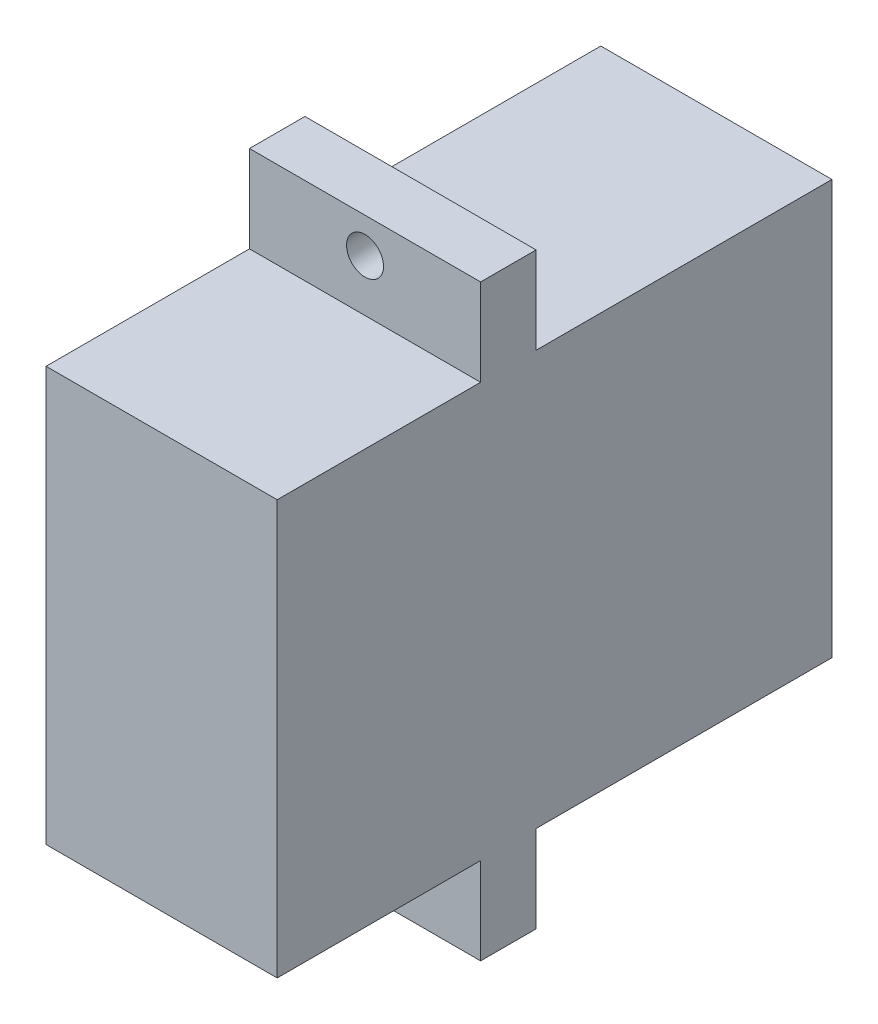
ISO-10303-21;
HEADER;
FILE_DESCRIPTION(('STEP AP214'),'2;1');
FILE_NAME('part.step','',(''),(''),'','','');
FILE_SCHEMA(('AUTOMOTIVE_DESIGN { 1 0 10303 214 1 1 1 1 }'));
ENDSEC;
DATA;
#1=APPLICATION_CONTEXT('core data for automotive mechanical design processes');
#2=APPLICATION_PROTOCOL_DEFINITION('international standard','automotive_design',2000,#1);
#3=PRODUCT_CONTEXT('',#1,'mechanical');
#4=PRODUCT('Part','Part','',(#3));
#5=PRODUCT_RELATED_PRODUCT_CATEGORY('part','',(#4));
#6=PRODUCT_DEFINITION_FORMATION('','',#4);
#7=PRODUCT_DEFINITION_CONTEXT('part definition',#1,'design');
#8=PRODUCT_DEFINITION('design','',#6,#7);
#9=PRODUCT_DEFINITION_SHAPE('','',#8);
#10=(LENGTH_UNIT() NAMED_UNIT(*) SI_UNIT(.MILLI.,.METRE.));
#11=(NAMED_UNIT(*) PLANE_ANGLE_UNIT() SI_UNIT($,.RADIAN.));
#12=(NAMED_UNIT(*) SI_UNIT($,.STERADIAN.) SOLID_ANGLE_UNIT());
#13=UNCERTAINTY_MEASURE_WITH_UNIT(LENGTH_MEASURE(1.E-05),#10,'distance_accuracy_value','');
#14=(GEOMETRIC_REPRESENTATION_CONTEXT(3) GLOBAL_UNCERTAINTY_ASSIGNED_CONTEXT((#13)) GLOBAL_UNIT_ASSIGNED_CONTEXT((#10,
#11,#12)) REPRESENTATION_CONTEXT('',''));
#15=CARTESIAN_POINT('',(0.,0.,0.));
#16=DIRECTION('',(0.,0.,1.));
#17=DIRECTION('',(1.,0.,0.));
#18=AXIS2_PLACEMENT_3D('',#15,#16,#17);
#19=CARTESIAN_POINT('',(0.,0.,0.));
#20=DIRECTION('',(0.,0.,1.));
#21=DIRECTION('',(1.,0.,0.));
#22=AXIS2_PLACEMENT_3D('',#19,#20,#21);
#23=PLANE('',#22);
#24=CARTESIAN_POINT('',(0.,-28.,0.));
#25=DIRECTION('',(0.,0.,1.));
#26=DIRECTION('',(1.,0.,0.));
#27=AXIS2_PLACEMENT_3D('',#24,#25,#26);
#28=CIRCLE('',#27,1.);
#29=CARTESIAN_POINT('',(1.,-28.,0.));
#30=VERTEX_POINT('',#29);
#31=EDGE_CURVE('E198',#30,#30,#28,.T.);
#32=ORIENTED_EDGE('',*,*,#31,.T.);
#33=EDGE_LOOP('',(#32));
#34=FACE_BOUND('',#33,.T.);
#35=DIRECTION('',(-1.,0.,0.));
#36=VECTOR('',#35,1.);
#37=CARTESIAN_POINT('',(-6.25,-25.2,0.));
#38=LINE('',#37,#36);
#39=CARTESIAN_POINT('',(6.25,-25.2,0.));
#40=VERTEX_POINT('',#39);
#41=CARTESIAN_POINT('',(-6.25,-25.2,0.));
#42=VERTEX_POINT('',#41);
#43=EDGE_CURVE('E55',#40,#42,#38,.T.);
#44=ORIENTED_EDGE('',*,*,#43,.F.);
#45=DIRECTION('',(0.,1.,0.));
#46=VECTOR('',#45,1.);
#47=CARTESIAN_POINT('',(6.25,1.9,0.));
#48=LINE('',#47,#46);
#49=CARTESIAN_POINT('',(6.25,-29.9,0.));
#50=VERTEX_POINT('',#49);
#51=EDGE_CURVE('E235',#50,#40,#48,.T.);
#52=ORIENTED_EDGE('',*,*,#51,.F.);
#53=DIRECTION('',(1.,0.,0.));
#54=VECTOR('',#53,1.);
#55=CARTESIAN_POINT('',(-6.25,-29.9,0.));
#56=LINE('',#55,#54);
#57=CARTESIAN_POINT('',(-6.25,-29.9,0.));
#58=VERTEX_POINT('',#57);
#59=EDGE_CURVE('E231',#58,#50,#56,.T.);
#60=ORIENTED_EDGE('',*,*,#59,.F.);
#61=DIRECTION('',(0.,-1.,0.));
#62=VECTOR('',#61,1.);
#63=CARTESIAN_POINT('',(-6.25,1.9,0.));
#64=LINE('',#63,#62);
#65=EDGE_CURVE('E60',#42,#58,#64,.T.);
#66=ORIENTED_EDGE('',*,*,#65,.F.);
#67=EDGE_LOOP('',(#44,#52,#60,#66));
#68=FACE_BOUND('',#67,.T.);
#69=ADVANCED_FACE('F39',(#34,#68),#23,.F.);
#70=CARTESIAN_POINT('',(0.,0.,0.));
#71=DIRECTION('',(0.,0.,1.));
#72=DIRECTION('',(1.,0.,0.));
#73=AXIS2_PLACEMENT_3D('',#70,#71,#72);
#74=CIRCLE('',#73,1.);
#75=CARTESIAN_POINT('',(1.,0.,0.));
#76=VERTEX_POINT('',#75);
#77=EDGE_CURVE('E203',#76,#76,#74,.T.);
#78=ORIENTED_EDGE('',*,*,#77,.T.);
#79=EDGE_LOOP('',(#78));
#80=FACE_BOUND('',#79,.T.);
#81=DIRECTION('',(1.,0.,0.));
#82=VECTOR('',#81,1.);
#83=CARTESIAN_POINT('',(-6.25,-2.8,0.));
#84=LINE('',#83,#82);
#85=CARTESIAN_POINT('',(-6.25,-2.8,0.));
#86=VERTEX_POINT('',#85);
#87=CARTESIAN_POINT('',(6.25,-2.8,0.));
#88=VERTEX_POINT('',#87);
#89=EDGE_CURVE('E414',#86,#88,#84,.T.);
#90=ORIENTED_EDGE('',*,*,#89,.F.);
#91=CARTESIAN_POINT('',(-6.25,1.9,0.));
#92=VERTEX_POINT('',#91);
#93=EDGE_CURVE('E154',#92,#86,#64,.T.);
#94=ORIENTED_EDGE('',*,*,#93,.F.);
#95=DIRECTION('',(-1.,0.,0.));
#96=VECTOR('',#95,1.);
#97=CARTESIAN_POINT('',(-6.25,1.9,0.));
#98=LINE('',#97,#96);
#99=CARTESIAN_POINT('',(6.25,1.9,0.));
#100=VERTEX_POINT('',#99);
#101=EDGE_CURVE('E238',#100,#92,#98,.T.);
#102=ORIENTED_EDGE('',*,*,#101,.F.);
#103=EDGE_CURVE('E234',#88,#100,#48,.T.);
#104=ORIENTED_EDGE('',*,*,#103,.F.);
#105=EDGE_LOOP('',(#90,#94,#102,#104));
#106=FACE_BOUND('',#105,.T.);
#107=ADVANCED_FACE('F303',(#80,#106),#23,.F.);
#108=CARTESIAN_POINT('',(0.,0.,3.));
#109=DIRECTION('',(0.,0.,1.));
#110=DIRECTION('',(1.,0.,0.));
#111=AXIS2_PLACEMENT_3D('',#108,#109,#110);
#112=PLANE('',#111);
#113=CARTESIAN_POINT('',(0.,0.,3.));
#114=DIRECTION('',(0.,0.,1.));
#115=DIRECTION('',(1.,0.,0.));
#116=AXIS2_PLACEMENT_3D('',#113,#114,#115);
#117=CIRCLE('',#116,1.);
#118=CARTESIAN_POINT('',(1.,0.,3.));
#119=VERTEX_POINT('',#118);
#120=EDGE_CURVE('E207',#119,#119,#117,.T.);
#121=ORIENTED_EDGE('',*,*,#120,.F.);
#122=EDGE_LOOP('',(#121));
#123=FACE_BOUND('',#122,.T.);
#124=DIRECTION('',(0.,-1.,0.));
#125=VECTOR('',#124,1.);
#126=CARTESIAN_POINT('',(-6.25,1.9,3.));
#127=LINE('',#126,#125);
#128=CARTESIAN_POINT('',(-6.25,1.9,3.));
#129=VERTEX_POINT('',#128);
#130=CARTESIAN_POINT('',(-6.25,-2.8,3.));
#131=VERTEX_POINT('',#130);
#132=EDGE_CURVE('E214',#129,#131,#127,.T.);
#133=ORIENTED_EDGE('',*,*,#132,.T.);
#134=DIRECTION('',(1.,0.,0.));
#135=VECTOR('',#134,1.);
#136=CARTESIAN_POINT('',(0.,-2.8,3.));
#137=LINE('',#136,#135);
#138=CARTESIAN_POINT('',(6.25,-2.8,3.));
#139=VERTEX_POINT('',#138);
#140=EDGE_CURVE('E156',#131,#139,#137,.T.);
#141=ORIENTED_EDGE('',*,*,#140,.T.);
#142=DIRECTION('',(0.,1.,0.));
#143=VECTOR('',#142,1.);
#144=CARTESIAN_POINT('',(6.25,1.9,3.));
#145=LINE('',#144,#143);
#146=CARTESIAN_POINT('',(6.25,1.9,3.));
#147=VERTEX_POINT('',#146);
#148=EDGE_CURVE('E221',#139,#147,#145,.T.);
#149=ORIENTED_EDGE('',*,*,#148,.T.);
#150=DIRECTION('',(-1.,0.,0.));
#151=VECTOR('',#150,1.);
#152=CARTESIAN_POINT('',(-6.25,1.9,3.));
#153=LINE('',#152,#151);
#154=EDGE_CURVE('E225',#147,#129,#153,.T.);
#155=ORIENTED_EDGE('',*,*,#154,.T.);
#156=EDGE_LOOP('',(#133,#141,#149,#155));
#157=FACE_BOUND('',#156,.T.);
#158=ADVANCED_FACE('F268',(#123,#157),#112,.T.);
#159=DIRECTION('',(1.,0.,0.));
#160=VECTOR('',#159,1.);
#161=CARTESIAN_POINT('',(0.,-25.2,3.));
#162=LINE('',#161,#160);
#163=CARTESIAN_POINT('',(-6.25,-25.2,3.));
#164=VERTEX_POINT('',#163);
#165=CARTESIAN_POINT('',(6.25,-25.2,3.));
#166=VERTEX_POINT('',#165);
#167=EDGE_CURVE('E160',#164,#166,#162,.T.);
#168=ORIENTED_EDGE('',*,*,#167,.F.);
#169=CARTESIAN_POINT('',(-6.25,-29.9,3.));
#170=VERTEX_POINT('',#169);
#171=EDGE_CURVE('E218',#164,#170,#127,.T.);
#172=ORIENTED_EDGE('',*,*,#171,.T.);
#173=DIRECTION('',(1.,0.,0.));
#174=VECTOR('',#173,1.);
#175=CARTESIAN_POINT('',(-6.25,-29.9,3.));
#176=LINE('',#175,#174);
#177=CARTESIAN_POINT('',(6.25,-29.9,3.));
#178=VERTEX_POINT('',#177);
#179=EDGE_CURVE('E217',#170,#178,#176,.T.);
#180=ORIENTED_EDGE('',*,*,#179,.T.);
#181=EDGE_CURVE('E222',#178,#166,#145,.T.);
#182=ORIENTED_EDGE('',*,*,#181,.T.);
#183=EDGE_LOOP('',(#168,#172,#180,#182));
#184=FACE_BOUND('',#183,.T.);
#185=CARTESIAN_POINT('',(0.,-28.,3.));
#186=DIRECTION('',(0.,0.,1.));
#187=DIRECTION('',(1.,0.,0.));
#188=AXIS2_PLACEMENT_3D('',#185,#186,#187);
#189=CIRCLE('',#188,1.);
#190=CARTESIAN_POINT('',(1.,-28.,3.));
#191=VERTEX_POINT('',#190);
#192=EDGE_CURVE('E199',#191,#191,#189,.T.);
#193=ORIENTED_EDGE('',*,*,#192,.F.);
#194=EDGE_LOOP('',(#193));
#195=FACE_BOUND('',#194,.T.);
#196=ADVANCED_FACE('F289',(#184,#195),#112,.T.);
#197=CARTESIAN_POINT('',(-6.25,1.9,3.));
#198=DIRECTION('',(1.,0.,0.));
#199=DIRECTION('',(0.,0.,-1.));
#200=AXIS2_PLACEMENT_3D('',#197,#198,#199);
#201=PLANE('',#200);
#202=ORIENTED_EDGE('',*,*,#93,.T.);
#203=DIRECTION('',(0.,0.,1.));
#204=VECTOR('',#203,1.);
#205=CARTESIAN_POINT('',(-6.25,-2.8,-16.));
#206=LINE('',#205,#204);
#207=CARTESIAN_POINT('',(-6.25,-2.8,-16.));
#208=VERTEX_POINT('',#207);
#209=EDGE_CURVE('E133',#208,#86,#206,.T.);
#210=ORIENTED_EDGE('',*,*,#209,.F.);
#211=DIRECTION('',(0.,1.,0.));
#212=VECTOR('',#211,1.);
#213=CARTESIAN_POINT('',(-6.25,-2.8,-16.));
#214=LINE('',#213,#212);
#215=CARTESIAN_POINT('',(-6.25,-25.2,-16.));
#216=VERTEX_POINT('',#215);
#217=EDGE_CURVE('E140',#216,#208,#214,.T.);
#218=ORIENTED_EDGE('',*,*,#217,.F.);
#219=DIRECTION('',(0.,0.,1.));
#220=VECTOR('',#219,1.);
#221=CARTESIAN_POINT('',(-6.25,-25.2,-16.));
#222=LINE('',#221,#220);
#223=EDGE_CURVE('E260',#216,#42,#222,.T.);
#224=ORIENTED_EDGE('',*,*,#223,.T.);
#225=ORIENTED_EDGE('',*,*,#65,.T.);
#226=DIRECTION('',(0.,0.,-1.));
#227=VECTOR('',#226,1.);
#228=CARTESIAN_POINT('',(-6.25,-29.9,3.));
#229=LINE('',#228,#227);
#230=EDGE_CURVE('E11',#170,#58,#229,.T.);
#231=ORIENTED_EDGE('',*,*,#230,.F.);
#232=ORIENTED_EDGE('',*,*,#171,.F.);
#233=DIRECTION('',(0.,0.,-1.));
#234=VECTOR('',#233,1.);
#235=CARTESIAN_POINT('',(-6.25,-25.2,14.));
#236=LINE('',#235,#234);
#237=CARTESIAN_POINT('',(-6.25,-25.2,14.));
#238=VERTEX_POINT('',#237);
#239=EDGE_CURVE('E190',#238,#164,#236,.T.);
#240=ORIENTED_EDGE('',*,*,#239,.F.);
#241=DIRECTION('',(0.,-1.,0.));
#242=VECTOR('',#241,1.);
#243=CARTESIAN_POINT('',(-6.25,0.,14.));
#244=LINE('',#243,#242);
#245=CARTESIAN_POINT('',(-6.25,-2.8,14.));
#246=VERTEX_POINT('',#245);
#247=EDGE_CURVE('E170',#246,#238,#244,.T.);
#248=ORIENTED_EDGE('',*,*,#247,.F.);
#249=DIRECTION('',(0.,0.,-1.));
#250=VECTOR('',#249,1.);
#251=CARTESIAN_POINT('',(-6.25,-2.8,14.));
#252=LINE('',#251,#250);
#253=EDGE_CURVE('E194',#246,#131,#252,.T.);
#254=ORIENTED_EDGE('',*,*,#253,.T.);
#255=ORIENTED_EDGE('',*,*,#132,.F.);
#256=DIRECTION('',(0.,0.,-1.));
#257=VECTOR('',#256,1.);
#258=CARTESIAN_POINT('',(-6.25,1.9,3.));
#259=LINE('',#258,#257);
#260=EDGE_CURVE('E228',#129,#92,#259,.T.);
#261=ORIENTED_EDGE('',*,*,#260,.T.);
#262=EDGE_LOOP('',(#202,#210,#218,#224,#225,#231,#232,#240,#248,#254,#255,#261));
#263=FACE_BOUND('',#262,.T.);
#264=ADVANCED_FACE('F41',(#263),#201,.F.);
#265=CARTESIAN_POINT('',(-6.25,-29.9,3.));
#266=DIRECTION('',(0.,1.,0.));
#267=DIRECTION('',(0.,0.,1.));
#268=AXIS2_PLACEMENT_3D('',#265,#266,#267);
#269=PLANE('',#268);
#270=ORIENTED_EDGE('',*,*,#59,.T.);
#271=DIRECTION('',(0.,0.,-1.));
#272=VECTOR('',#271,1.);
#273=CARTESIAN_POINT('',(6.25,-29.9,3.));
#274=LINE('',#273,#272);
#275=EDGE_CURVE('E48',#178,#50,#274,.T.);
#276=ORIENTED_EDGE('',*,*,#275,.F.);
#277=ORIENTED_EDGE('',*,*,#179,.F.);
#278=ORIENTED_EDGE('',*,*,#230,.T.);
#279=EDGE_LOOP('',(#270,#276,#277,#278));
#280=FACE_BOUND('',#279,.T.);
#281=ADVANCED_FACE('F257',(#280),#269,.F.);
#282=CARTESIAN_POINT('',(6.25,1.9,3.));
#283=DIRECTION('',(-1.,0.,0.));
#284=DIRECTION('',(0.,-1.,0.));
#285=AXIS2_PLACEMENT_3D('',#282,#283,#284);
#286=PLANE('',#285);
#287=ORIENTED_EDGE('',*,*,#51,.T.);
#288=DIRECTION('',(0.,0.,1.));
#289=VECTOR('',#288,1.);
#290=CARTESIAN_POINT('',(6.25,-25.2,-16.));
#291=LINE('',#290,#289);
#292=CARTESIAN_POINT('',(6.25,-25.2,-16.));
#293=VERTEX_POINT('',#292);
#294=EDGE_CURVE('E162',#293,#40,#291,.T.);
#295=ORIENTED_EDGE('',*,*,#294,.F.);
#296=DIRECTION('',(0.,-1.,0.));
#297=VECTOR('',#296,1.);
#298=CARTESIAN_POINT('',(6.25,-2.8,-16.));
#299=LINE('',#298,#297);
#300=CARTESIAN_POINT('',(6.25,-2.8,-16.));
#301=VERTEX_POINT('',#300);
#302=EDGE_CURVE('E139',#301,#293,#299,.T.);
#303=ORIENTED_EDGE('',*,*,#302,.F.);
#304=DIRECTION('',(0.,0.,1.));
#305=VECTOR('',#304,1.);
#306=CARTESIAN_POINT('',(6.25,-2.8,-16.));
#307=LINE('',#306,#305);
#308=EDGE_CURVE('E135',#301,#88,#307,.T.);
#309=ORIENTED_EDGE('',*,*,#308,.T.);
#310=ORIENTED_EDGE('',*,*,#103,.T.);
#311=DIRECTION('',(0.,0.,-1.));
#312=VECTOR('',#311,1.);
#313=CARTESIAN_POINT('',(6.25,1.9,3.));
#314=LINE('',#313,#312);
#315=EDGE_CURVE('E243',#147,#100,#314,.T.);
#316=ORIENTED_EDGE('',*,*,#315,.F.);
#317=ORIENTED_EDGE('',*,*,#148,.F.);
#318=DIRECTION('',(0.,0.,-1.));
#319=VECTOR('',#318,1.);
#320=CARTESIAN_POINT('',(6.25,-2.8,14.));
#321=LINE('',#320,#319);
#322=CARTESIAN_POINT('',(6.25,-2.8,14.));
#323=VERTEX_POINT('',#322);
#324=EDGE_CURVE('E178',#323,#139,#321,.T.);
#325=ORIENTED_EDGE('',*,*,#324,.F.);
#326=DIRECTION('',(0.,1.,0.));
#327=VECTOR('',#326,1.);
#328=CARTESIAN_POINT('',(6.25,0.,14.));
#329=LINE('',#328,#327);
#330=CARTESIAN_POINT('',(6.25,-25.2,14.));
#331=VERTEX_POINT('',#330);
#332=EDGE_CURVE('E176',#331,#323,#329,.T.);
#333=ORIENTED_EDGE('',*,*,#332,.F.);
#334=DIRECTION('',(0.,0.,-1.));
#335=VECTOR('',#334,1.);
#336=CARTESIAN_POINT('',(6.25,-25.2,14.));
#337=LINE('',#336,#335);
#338=EDGE_CURVE('E186',#331,#166,#337,.T.);
#339=ORIENTED_EDGE('',*,*,#338,.T.);
#340=ORIENTED_EDGE('',*,*,#181,.F.);
#341=ORIENTED_EDGE('',*,*,#275,.T.);
#342=EDGE_LOOP('',(#287,#295,#303,#309,#310,#316,#317,#325,#333,#339,#340,#341));
#343=FACE_BOUND('',#342,.T.);
#344=ADVANCED_FACE('F251',(#343),#286,.F.);
#345=CARTESIAN_POINT('',(-6.25,1.9,3.));
#346=DIRECTION('',(0.,-1.,0.));
#347=DIRECTION('',(1.,0.,0.));
#348=AXIS2_PLACEMENT_3D('',#345,#346,#347);
#349=PLANE('',#348);
#350=ORIENTED_EDGE('',*,*,#101,.T.);
#351=ORIENTED_EDGE('',*,*,#260,.F.);
#352=ORIENTED_EDGE('',*,*,#154,.F.);
#353=ORIENTED_EDGE('',*,*,#315,.T.);
#354=EDGE_LOOP('',(#350,#351,#352,#353));
#355=FACE_BOUND('',#354,.T.);
#356=ADVANCED_FACE('F275',(#355),#349,.F.);
#357=CARTESIAN_POINT('',(0.,0.,3.));
#358=DIRECTION('',(0.,0.,-1.));
#359=DIRECTION('',(-1.,0.,0.));
#360=AXIS2_PLACEMENT_3D('',#357,#358,#359);
#361=CYLINDRICAL_SURFACE('',#360,1.);
#362=ORIENTED_EDGE('',*,*,#120,.T.);
#363=EDGE_LOOP('',(#362));
#364=FACE_BOUND('',#363,.T.);
#365=ORIENTED_EDGE('',*,*,#77,.F.);
#366=EDGE_LOOP('',(#365));
#367=FACE_BOUND('',#366,.T.);
#368=ADVANCED_FACE('F298',(#364,#367),#361,.F.);
#369=CARTESIAN_POINT('',(0.,-28.,3.));
#370=DIRECTION('',(0.,0.,-1.));
#371=DIRECTION('',(-1.,0.,0.));
#372=AXIS2_PLACEMENT_3D('',#369,#370,#371);
#373=CYLINDRICAL_SURFACE('',#372,1.);
#374=ORIENTED_EDGE('',*,*,#192,.T.);
#375=EDGE_LOOP('',(#374));
#376=FACE_BOUND('',#375,.T.);
#377=ORIENTED_EDGE('',*,*,#31,.F.);
#378=EDGE_LOOP('',(#377));
#379=FACE_BOUND('',#378,.T.);
#380=ADVANCED_FACE('F295',(#376,#379),#373,.F.);
#381=CARTESIAN_POINT('',(0.,-2.8,14.));
#382=DIRECTION('',(0.,1.,0.));
#383=DIRECTION('',(0.,0.,1.));
#384=AXIS2_PLACEMENT_3D('',#381,#382,#383);
#385=PLANE('',#384);
#386=ORIENTED_EDGE('',*,*,#140,.F.);
#387=ORIENTED_EDGE('',*,*,#253,.F.);
#388=DIRECTION('',(1.,0.,0.));
#389=VECTOR('',#388,1.);
#390=CARTESIAN_POINT('',(0.,-2.8,14.));
#391=LINE('',#390,#389);
#392=EDGE_CURVE('E166',#246,#323,#391,.T.);
#393=ORIENTED_EDGE('',*,*,#392,.T.);
#394=ORIENTED_EDGE('',*,*,#324,.T.);
#395=EDGE_LOOP('',(#386,#387,#393,#394));
#396=FACE_BOUND('',#395,.T.);
#397=ADVANCED_FACE('F280',(#396),#385,.T.);
#398=CARTESIAN_POINT('',(0.,-25.2,14.));
#399=DIRECTION('',(0.,1.,0.));
#400=DIRECTION('',(0.,0.,1.));
#401=AXIS2_PLACEMENT_3D('',#398,#399,#400);
#402=PLANE('',#401);
#403=ORIENTED_EDGE('',*,*,#167,.T.);
#404=ORIENTED_EDGE('',*,*,#338,.F.);
#405=DIRECTION('',(1.,0.,0.));
#406=VECTOR('',#405,1.);
#407=CARTESIAN_POINT('',(0.,-25.2,14.));
#408=LINE('',#407,#406);
#409=EDGE_CURVE('E173',#238,#331,#408,.T.);
#410=ORIENTED_EDGE('',*,*,#409,.F.);
#411=ORIENTED_EDGE('',*,*,#239,.T.);
#412=EDGE_LOOP('',(#403,#404,#410,#411));
#413=FACE_BOUND('',#412,.T.);
#414=ADVANCED_FACE('F287',(#413),#402,.F.);
#415=CARTESIAN_POINT('',(0.,0.,14.));
#416=DIRECTION('',(0.,0.,1.));
#417=DIRECTION('',(1.,0.,0.));
#418=AXIS2_PLACEMENT_3D('',#415,#416,#417);
#419=PLANE('',#418);
#420=ORIENTED_EDGE('',*,*,#392,.F.);
#421=ORIENTED_EDGE('',*,*,#247,.T.);
#422=ORIENTED_EDGE('',*,*,#409,.T.);
#423=ORIENTED_EDGE('',*,*,#332,.T.);
#424=EDGE_LOOP('',(#420,#421,#422,#423));
#425=FACE_BOUND('',#424,.T.);
#426=ADVANCED_FACE('F284',(#425),#419,.T.);
#427=CARTESIAN_POINT('',(-6.25,-2.8,-16.));
#428=DIRECTION('',(0.,-1.,0.));
#429=DIRECTION('',(1.,0.,0.));
#430=AXIS2_PLACEMENT_3D('',#427,#428,#429);
#431=PLANE('',#430);
#432=ORIENTED_EDGE('',*,*,#89,.T.);
#433=ORIENTED_EDGE('',*,*,#308,.F.);
#434=DIRECTION('',(1.,0.,0.));
#435=VECTOR('',#434,1.);
#436=CARTESIAN_POINT('',(-6.25,-2.8,-16.));
#437=LINE('',#436,#435);
#438=EDGE_CURVE('E128',#208,#301,#437,.T.);
#439=ORIENTED_EDGE('',*,*,#438,.F.);
#440=ORIENTED_EDGE('',*,*,#209,.T.);
#441=EDGE_LOOP('',(#432,#433,#439,#440));
#442=FACE_BOUND('',#441,.T.);
#443=ADVANCED_FACE('F131',(#442),#431,.F.);
#444=CARTESIAN_POINT('',(-6.25,-25.2,-16.));
#445=DIRECTION('',(0.,1.,0.));
#446=DIRECTION('',(0.,0.,1.));
#447=AXIS2_PLACEMENT_3D('',#444,#445,#446);
#448=PLANE('',#447);
#449=ORIENTED_EDGE('',*,*,#43,.T.);
#450=ORIENTED_EDGE('',*,*,#223,.F.);
#451=DIRECTION('',(-1.,0.,0.));
#452=VECTOR('',#451,1.);
#453=CARTESIAN_POINT('',(-6.25,-25.2,-16.));
#454=LINE('',#453,#452);
#455=EDGE_CURVE('E145',#293,#216,#454,.T.);
#456=ORIENTED_EDGE('',*,*,#455,.F.);
#457=ORIENTED_EDGE('',*,*,#294,.T.);
#458=EDGE_LOOP('',(#449,#450,#456,#457));
#459=FACE_BOUND('',#458,.T.);
#460=ADVANCED_FACE('F392',(#459),#448,.F.);
#461=CARTESIAN_POINT('',(0.,0.,-16.));
#462=DIRECTION('',(0.,0.,1.));
#463=DIRECTION('',(1.,0.,0.));
#464=AXIS2_PLACEMENT_3D('',#461,#462,#463);
#465=PLANE('',#464);
#466=ORIENTED_EDGE('',*,*,#217,.T.);
#467=ORIENTED_EDGE('',*,*,#438,.T.);
#468=ORIENTED_EDGE('',*,*,#302,.T.);
#469=ORIENTED_EDGE('',*,*,#455,.T.);
#470=EDGE_LOOP('',(#466,#467,#468,#469));
#471=FACE_BOUND('',#470,.T.);
#472=ADVANCED_FACE('F143',(#471),#465,.F.);
#473=CLOSED_SHELL('',(#69,#107,#158,#196,#264,#281,#344,#356,#368,#380,#397,#414,#426,#443,#460,#472));
#474=MANIFOLD_SOLID_BREP('B2',#473);
#475=ADVANCED_BREP_SHAPE_REPRESENTATION('',(#18,#474),#14);
#476=SHAPE_DEFINITION_REPRESENTATION(#9,#475);
ENDSEC;
END-ISO-10303-21;
